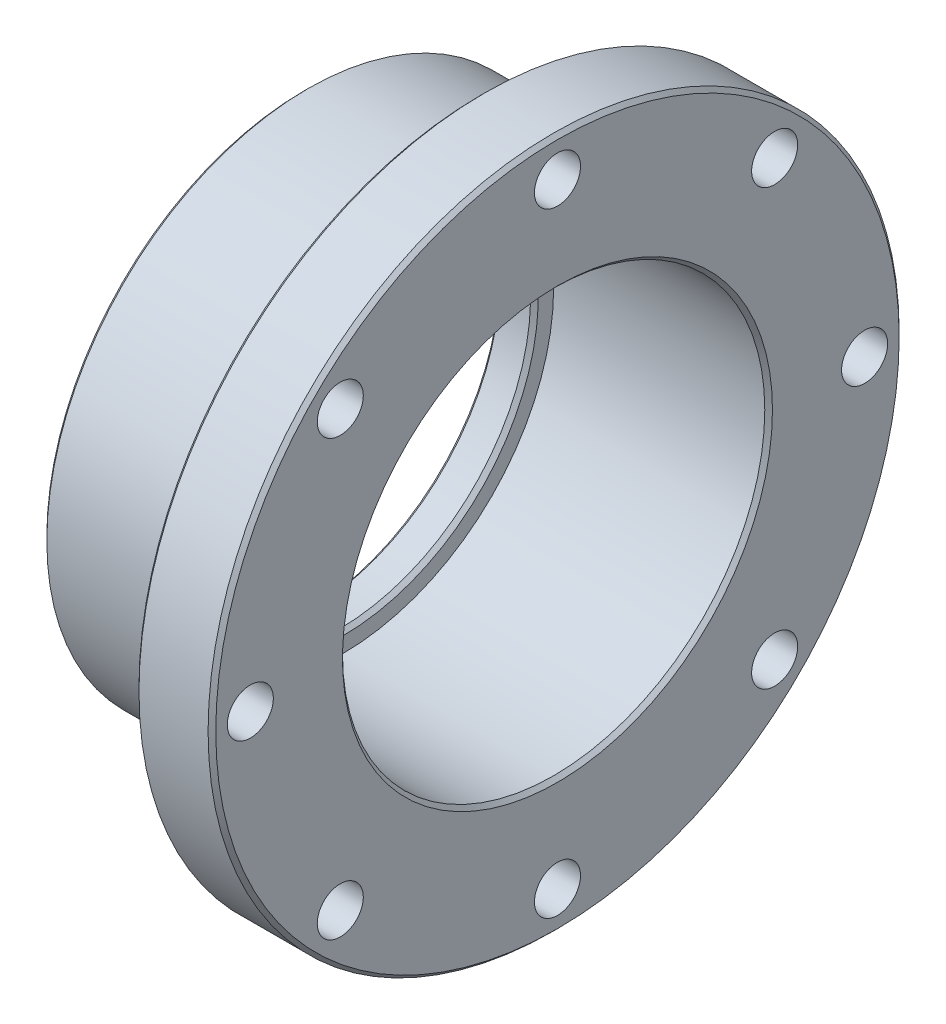
ISO-10303-21;
HEADER;
FILE_DESCRIPTION(('STEP AP214'),'2;1');
FILE_NAME('part.step','',(''),(''),'','','');
FILE_SCHEMA(('AUTOMOTIVE_DESIGN { 1 0 10303 214 1 1 1 1 }'));
ENDSEC;
DATA;
#1=APPLICATION_CONTEXT('core data for automotive mechanical design processes');
#2=APPLICATION_PROTOCOL_DEFINITION('international standard','automotive_design',2000,#1);
#3=PRODUCT_CONTEXT('',#1,'mechanical');
#4=PRODUCT('Part','Part','',(#3));
#5=PRODUCT_RELATED_PRODUCT_CATEGORY('part','',(#4));
#6=PRODUCT_DEFINITION_FORMATION('','',#4);
#7=PRODUCT_DEFINITION_CONTEXT('part definition',#1,'design');
#8=PRODUCT_DEFINITION('design','',#6,#7);
#9=PRODUCT_DEFINITION_SHAPE('','',#8);
#10=(LENGTH_UNIT() NAMED_UNIT(*) SI_UNIT(.MILLI.,.METRE.));
#11=(NAMED_UNIT(*) PLANE_ANGLE_UNIT() SI_UNIT($,.RADIAN.));
#12=(NAMED_UNIT(*) SI_UNIT($,.STERADIAN.) SOLID_ANGLE_UNIT());
#13=UNCERTAINTY_MEASURE_WITH_UNIT(LENGTH_MEASURE(1.E-05),#10,'distance_accuracy_value','');
#14=(GEOMETRIC_REPRESENTATION_CONTEXT(3) GLOBAL_UNCERTAINTY_ASSIGNED_CONTEXT((#13)) GLOBAL_UNIT_ASSIGNED_CONTEXT((#10,
#11,#12)) REPRESENTATION_CONTEXT('',''));
#15=CARTESIAN_POINT('',(0.,0.,0.));
#16=DIRECTION('',(0.,0.,1.));
#17=DIRECTION('',(1.,0.,0.));
#18=AXIS2_PLACEMENT_3D('',#15,#16,#17);
#19=CARTESIAN_POINT('',(0.,0.,0.));
#20=DIRECTION('',(-1.,0.,0.));
#21=DIRECTION('',(0.,0.,1.));
#22=AXIS2_PLACEMENT_3D('',#19,#20,#21);
#23=PLANE('',#22);
#24=CARTESIAN_POINT('',(0.,0.,0.));
#25=DIRECTION('',(-1.,0.,0.));
#26=DIRECTION('',(0.,0.,1.));
#27=AXIS2_PLACEMENT_3D('',#24,#25,#26);
#28=CIRCLE('',#27,33.5);
#29=CARTESIAN_POINT('',(0.,0.,33.5));
#30=VERTEX_POINT('',#29);
#31=EDGE_CURVE('E10',#30,#30,#28,.T.);
#32=ORIENTED_EDGE('',*,*,#31,.T.);
#33=EDGE_LOOP('',(#32));
#34=FACE_BOUND('',#33,.T.);
#35=CARTESIAN_POINT('',(0.,0.,0.));
#36=DIRECTION('',(-1.,0.,0.));
#37=DIRECTION('',(0.,0.,1.));
#38=AXIS2_PLACEMENT_3D('',#35,#36,#37);
#39=CIRCLE('',#38,25.5);
#40=CARTESIAN_POINT('',(0.,0.,25.5));
#41=VERTEX_POINT('',#40);
#42=EDGE_CURVE('E44',#41,#41,#39,.F.);
#43=ORIENTED_EDGE('',*,*,#42,.T.);
#44=EDGE_LOOP('',(#43));
#45=FACE_BOUND('',#44,.T.);
#46=ADVANCED_FACE('F36',(#34,#45),#23,.T.);
#47=CARTESIAN_POINT('',(0.,0.,0.));
#48=DIRECTION('',(1.,0.,0.));
#49=DIRECTION('',(0.,0.,-1.));
#50=AXIS2_PLACEMENT_3D('',#47,#48,#49);
#51=CYLINDRICAL_SURFACE('',#50,34.);
#52=CARTESIAN_POINT('',(0.499999999999994,0.,0.));
#53=DIRECTION('',(-1.,0.,0.));
#54=DIRECTION('',(0.,0.,1.));
#55=AXIS2_PLACEMENT_3D('',#52,#53,#54);
#56=CIRCLE('',#55,34.);
#57=CARTESIAN_POINT('',(0.499999999999994,0.,34.));
#58=VERTEX_POINT('',#57);
#59=EDGE_CURVE('E48',#58,#58,#56,.F.);
#60=ORIENTED_EDGE('',*,*,#59,.T.);
#61=EDGE_LOOP('',(#60));
#62=FACE_BOUND('',#61,.T.);
#63=CARTESIAN_POINT('',(23.,0.,0.));
#64=DIRECTION('',(1.,0.,0.));
#65=DIRECTION('',(0.,0.,-1.));
#66=AXIS2_PLACEMENT_3D('',#63,#64,#65);
#67=CIRCLE('',#66,34.);
#68=CARTESIAN_POINT('',(23.,0.,-34.));
#69=VERTEX_POINT('',#68);
#70=EDGE_CURVE('E81',#69,#69,#67,.T.);
#71=ORIENTED_EDGE('',*,*,#70,.F.);
#72=EDGE_LOOP('',(#71));
#73=FACE_BOUND('',#72,.T.);
#74=ADVANCED_FACE('F142',(#62,#73),#51,.T.);
#75=CARTESIAN_POINT('',(23.,34.,0.));
#76=DIRECTION('',(-1.,0.,0.));
#77=DIRECTION('',(0.,0.,1.));
#78=AXIS2_PLACEMENT_3D('',#75,#76,#77);
#79=PLANE('',#78);
#80=CARTESIAN_POINT('',(23.,0.,0.));
#81=DIRECTION('',(-1.,0.,0.));
#82=DIRECTION('',(0.,0.,1.));
#83=AXIS2_PLACEMENT_3D('',#80,#81,#82);
#84=CIRCLE('',#83,44.5);
#85=CARTESIAN_POINT('',(23.,0.,44.5));
#86=VERTEX_POINT('',#85);
#87=EDGE_CURVE('E52',#86,#86,#84,.T.);
#88=ORIENTED_EDGE('',*,*,#87,.T.);
#89=EDGE_LOOP('',(#88));
#90=FACE_BOUND('',#89,.T.);
#91=CARTESIAN_POINT('',(23.,40.,0.));
#92=DIRECTION('',(-1.,0.,0.));
#93=DIRECTION('',(0.,0.,1.));
#94=AXIS2_PLACEMENT_3D('',#91,#92,#93);
#95=CIRCLE('',#94,3.);
#96=CARTESIAN_POINT('',(23.,40.,3.));
#97=VERTEX_POINT('',#96);
#98=EDGE_CURVE('E87',#97,#97,#95,.T.);
#99=ORIENTED_EDGE('',*,*,#98,.F.);
#100=EDGE_LOOP('',(#99));
#101=FACE_BOUND('',#100,.T.);
#102=CARTESIAN_POINT('',(23.,28.2842712474619,28.2842712474619));
#103=DIRECTION('',(-1.,0.,0.));
#104=DIRECTION('',(0.,0.,1.));
#105=AXIS2_PLACEMENT_3D('',#102,#103,#104);
#106=CIRCLE('',#105,2.99999999999999);
#107=CARTESIAN_POINT('',(23.,28.2842712474619,31.2842712474619));
#108=VERTEX_POINT('',#107);
#109=EDGE_CURVE('E127',#108,#108,#106,.T.);
#110=ORIENTED_EDGE('',*,*,#109,.F.);
#111=EDGE_LOOP('',(#110));
#112=FACE_BOUND('',#111,.T.);
#113=CARTESIAN_POINT('',(23.,0.,40.));
#114=DIRECTION('',(-1.,0.,0.));
#115=DIRECTION('',(0.,0.,1.));
#116=AXIS2_PLACEMENT_3D('',#113,#114,#115);
#117=CIRCLE('',#116,3.);
#118=CARTESIAN_POINT('',(23.,0.,43.));
#119=VERTEX_POINT('',#118);
#120=EDGE_CURVE('E121',#119,#119,#117,.T.);
#121=ORIENTED_EDGE('',*,*,#120,.F.);
#122=EDGE_LOOP('',(#121));
#123=FACE_BOUND('',#122,.T.);
#124=CARTESIAN_POINT('',(23.,-28.2842712474619,28.2842712474619));
#125=DIRECTION('',(-1.,0.,0.));
#126=DIRECTION('',(0.,0.,1.));
#127=AXIS2_PLACEMENT_3D('',#124,#125,#126);
#128=CIRCLE('',#127,2.99999999999999);
#129=CARTESIAN_POINT('',(23.,-28.2842712474619,31.2842712474619));
#130=VERTEX_POINT('',#129);
#131=EDGE_CURVE('E115',#130,#130,#128,.T.);
#132=ORIENTED_EDGE('',*,*,#131,.F.);
#133=EDGE_LOOP('',(#132));
#134=FACE_BOUND('',#133,.T.);
#135=CARTESIAN_POINT('',(23.,-40.,0.));
#136=DIRECTION('',(-1.,0.,0.));
#137=DIRECTION('',(0.,0.,1.));
#138=AXIS2_PLACEMENT_3D('',#135,#136,#137);
#139=CIRCLE('',#138,3.);
#140=CARTESIAN_POINT('',(23.,-40.,3.00000000000001));
#141=VERTEX_POINT('',#140);
#142=EDGE_CURVE('E109',#141,#141,#139,.T.);
#143=ORIENTED_EDGE('',*,*,#142,.F.);
#144=EDGE_LOOP('',(#143));
#145=FACE_BOUND('',#144,.T.);
#146=CARTESIAN_POINT('',(23.,-28.2842712474619,-28.2842712474619));
#147=DIRECTION('',(-1.,0.,0.));
#148=DIRECTION('',(0.,0.,1.));
#149=AXIS2_PLACEMENT_3D('',#146,#147,#148);
#150=CIRCLE('',#149,2.99999999999999);
#151=CARTESIAN_POINT('',(23.,-28.2842712474619,-25.2842712474619));
#152=VERTEX_POINT('',#151);
#153=EDGE_CURVE('E103',#152,#152,#150,.T.);
#154=ORIENTED_EDGE('',*,*,#153,.F.);
#155=EDGE_LOOP('',(#154));
#156=FACE_BOUND('',#155,.T.);
#157=CARTESIAN_POINT('',(23.,0.,-40.));
#158=DIRECTION('',(-1.,0.,0.));
#159=DIRECTION('',(0.,0.,1.));
#160=AXIS2_PLACEMENT_3D('',#157,#158,#159);
#161=CIRCLE('',#160,3.);
#162=CARTESIAN_POINT('',(23.,0.,-37.));
#163=VERTEX_POINT('',#162);
#164=EDGE_CURVE('E97',#163,#163,#161,.T.);
#165=ORIENTED_EDGE('',*,*,#164,.F.);
#166=EDGE_LOOP('',(#165));
#167=FACE_BOUND('',#166,.T.);
#168=CARTESIAN_POINT('',(23.,28.2842712474619,-28.2842712474619));
#169=DIRECTION('',(-1.,0.,0.));
#170=DIRECTION('',(0.,0.,1.));
#171=AXIS2_PLACEMENT_3D('',#168,#169,#170);
#172=CIRCLE('',#171,3.);
#173=CARTESIAN_POINT('',(23.,28.2842712474619,-25.2842712474619));
#174=VERTEX_POINT('',#173);
#175=EDGE_CURVE('E91',#174,#174,#172,.T.);
#176=ORIENTED_EDGE('',*,*,#175,.F.);
#177=EDGE_LOOP('',(#176));
#178=FACE_BOUND('',#177,.T.);
#179=ORIENTED_EDGE('',*,*,#70,.T.);
#180=EDGE_LOOP('',(#179));
#181=FACE_BOUND('',#180,.T.);
#182=ADVANCED_FACE('F138',(#90,#101,#112,#123,#134,#145,#156,#167,#178,#181),#79,.T.);
#183=CARTESIAN_POINT('',(0.,0.,0.));
#184=DIRECTION('',(1.,0.,0.));
#185=DIRECTION('',(0.,0.,-1.));
#186=AXIS2_PLACEMENT_3D('',#183,#184,#185);
#187=CYLINDRICAL_SURFACE('',#186,45.);
#188=CARTESIAN_POINT('',(32.5,0.,0.));
#189=DIRECTION('',(1.,0.,0.));
#190=DIRECTION('',(0.,0.,-1.));
#191=AXIS2_PLACEMENT_3D('',#188,#189,#190);
#192=CIRCLE('',#191,45.);
#193=CARTESIAN_POINT('',(32.5,0.,-45.));
#194=VERTEX_POINT('',#193);
#195=EDGE_CURVE('E57',#194,#194,#192,.F.);
#196=ORIENTED_EDGE('',*,*,#195,.T.);
#197=EDGE_LOOP('',(#196));
#198=FACE_BOUND('',#197,.T.);
#199=CARTESIAN_POINT('',(23.5,0.,0.));
#200=DIRECTION('',(-1.,0.,0.));
#201=DIRECTION('',(0.,0.,1.));
#202=AXIS2_PLACEMENT_3D('',#199,#200,#201);
#203=CIRCLE('',#202,45.);
#204=CARTESIAN_POINT('',(23.5,0.,45.));
#205=VERTEX_POINT('',#204);
#206=EDGE_CURVE('E60',#205,#205,#203,.F.);
#207=ORIENTED_EDGE('',*,*,#206,.T.);
#208=EDGE_LOOP('',(#207));
#209=FACE_BOUND('',#208,.T.);
#210=ADVANCED_FACE('F141',(#198,#209),#187,.T.);
#211=CARTESIAN_POINT('',(33.,45.,0.));
#212=DIRECTION('',(1.,0.,0.));
#213=DIRECTION('',(0.,0.,-1.));
#214=AXIS2_PLACEMENT_3D('',#211,#212,#213);
#215=PLANE('',#214);
#216=CARTESIAN_POINT('',(33.,0.,0.));
#217=DIRECTION('',(1.,0.,0.));
#218=DIRECTION('',(0.,0.,-1.));
#219=AXIS2_PLACEMENT_3D('',#216,#217,#218);
#220=CIRCLE('',#219,28.);
#221=CARTESIAN_POINT('',(33.,0.,-28.));
#222=VERTEX_POINT('',#221);
#223=EDGE_CURVE('E63',#222,#222,#220,.F.);
#224=ORIENTED_EDGE('',*,*,#223,.T.);
#225=EDGE_LOOP('',(#224));
#226=FACE_BOUND('',#225,.T.);
#227=CARTESIAN_POINT('',(33.,0.,0.));
#228=DIRECTION('',(1.,0.,0.));
#229=DIRECTION('',(0.,0.,-1.));
#230=AXIS2_PLACEMENT_3D('',#227,#228,#229);
#231=CIRCLE('',#230,44.5);
#232=CARTESIAN_POINT('',(33.,0.,-44.5));
#233=VERTEX_POINT('',#232);
#234=EDGE_CURVE('E66',#233,#233,#231,.T.);
#235=ORIENTED_EDGE('',*,*,#234,.T.);
#236=EDGE_LOOP('',(#235));
#237=FACE_BOUND('',#236,.T.);
#238=CARTESIAN_POINT('',(33.,40.,0.));
#239=DIRECTION('',(1.,0.,0.));
#240=DIRECTION('',(0.,0.,-1.));
#241=AXIS2_PLACEMENT_3D('',#238,#239,#240);
#242=CIRCLE('',#241,3.);
#243=CARTESIAN_POINT('',(33.,40.,-3.));
#244=VERTEX_POINT('',#243);
#245=EDGE_CURVE('E130',#244,#244,#242,.F.);
#246=ORIENTED_EDGE('',*,*,#245,.T.);
#247=EDGE_LOOP('',(#246));
#248=FACE_BOUND('',#247,.T.);
#249=CARTESIAN_POINT('',(33.,28.2842712474619,28.2842712474619));
#250=DIRECTION('',(1.,0.,0.));
#251=DIRECTION('',(0.,0.,-1.));
#252=AXIS2_PLACEMENT_3D('',#249,#250,#251);
#253=CIRCLE('',#252,2.99999999999999);
#254=CARTESIAN_POINT('',(33.,28.2842712474619,25.2842712474619));
#255=VERTEX_POINT('',#254);
#256=EDGE_CURVE('E124',#255,#255,#253,.F.);
#257=ORIENTED_EDGE('',*,*,#256,.T.);
#258=EDGE_LOOP('',(#257));
#259=FACE_BOUND('',#258,.T.);
#260=CARTESIAN_POINT('',(33.,0.,40.));
#261=DIRECTION('',(1.,0.,0.));
#262=DIRECTION('',(0.,0.,-1.));
#263=AXIS2_PLACEMENT_3D('',#260,#261,#262);
#264=CIRCLE('',#263,3.);
#265=CARTESIAN_POINT('',(33.,0.,37.));
#266=VERTEX_POINT('',#265);
#267=EDGE_CURVE('E118',#266,#266,#264,.F.);
#268=ORIENTED_EDGE('',*,*,#267,.T.);
#269=EDGE_LOOP('',(#268));
#270=FACE_BOUND('',#269,.T.);
#271=CARTESIAN_POINT('',(33.,-28.2842712474619,28.2842712474619));
#272=DIRECTION('',(1.,0.,0.));
#273=DIRECTION('',(0.,0.,-1.));
#274=AXIS2_PLACEMENT_3D('',#271,#272,#273);
#275=CIRCLE('',#274,2.99999999999999);
#276=CARTESIAN_POINT('',(33.,-28.2842712474619,25.2842712474619));
#277=VERTEX_POINT('',#276);
#278=EDGE_CURVE('E112',#277,#277,#275,.F.);
#279=ORIENTED_EDGE('',*,*,#278,.T.);
#280=EDGE_LOOP('',(#279));
#281=FACE_BOUND('',#280,.T.);
#282=CARTESIAN_POINT('',(33.,-40.,0.));
#283=DIRECTION('',(1.,0.,0.));
#284=DIRECTION('',(0.,0.,-1.));
#285=AXIS2_PLACEMENT_3D('',#282,#283,#284);
#286=CIRCLE('',#285,3.);
#287=CARTESIAN_POINT('',(33.,-40.,-3.));
#288=VERTEX_POINT('',#287);
#289=EDGE_CURVE('E106',#288,#288,#286,.F.);
#290=ORIENTED_EDGE('',*,*,#289,.T.);
#291=EDGE_LOOP('',(#290));
#292=FACE_BOUND('',#291,.T.);
#293=CARTESIAN_POINT('',(33.,-28.2842712474619,-28.2842712474619));
#294=DIRECTION('',(1.,0.,0.));
#295=DIRECTION('',(0.,0.,-1.));
#296=AXIS2_PLACEMENT_3D('',#293,#294,#295);
#297=CIRCLE('',#296,2.99999999999999);
#298=CARTESIAN_POINT('',(33.,-28.2842712474619,-31.2842712474619));
#299=VERTEX_POINT('',#298);
#300=EDGE_CURVE('E100',#299,#299,#297,.F.);
#301=ORIENTED_EDGE('',*,*,#300,.T.);
#302=EDGE_LOOP('',(#301));
#303=FACE_BOUND('',#302,.T.);
#304=CARTESIAN_POINT('',(33.,0.,-40.));
#305=DIRECTION('',(1.,0.,0.));
#306=DIRECTION('',(0.,0.,-1.));
#307=AXIS2_PLACEMENT_3D('',#304,#305,#306);
#308=CIRCLE('',#307,3.);
#309=CARTESIAN_POINT('',(33.,0.,-43.));
#310=VERTEX_POINT('',#309);
#311=EDGE_CURVE('E94',#310,#310,#308,.F.);
#312=ORIENTED_EDGE('',*,*,#311,.T.);
#313=EDGE_LOOP('',(#312));
#314=FACE_BOUND('',#313,.T.);
#315=CARTESIAN_POINT('',(33.,28.2842712474619,-28.2842712474619));
#316=DIRECTION('',(1.,0.,0.));
#317=DIRECTION('',(0.,0.,-1.));
#318=AXIS2_PLACEMENT_3D('',#315,#316,#317);
#319=CIRCLE('',#318,3.);
#320=CARTESIAN_POINT('',(33.,28.2842712474619,-31.2842712474619));
#321=VERTEX_POINT('',#320);
#322=EDGE_CURVE('E88',#321,#321,#319,.F.);
#323=ORIENTED_EDGE('',*,*,#322,.T.);
#324=EDGE_LOOP('',(#323));
#325=FACE_BOUND('',#324,.T.);
#326=ADVANCED_FACE('F217',(#226,#237,#248,#259,#270,#281,#292,#303,#314,#325),#215,.T.);
#327=CARTESIAN_POINT('',(0.,0.,0.));
#328=DIRECTION('',(1.,0.,0.));
#329=DIRECTION('',(0.,1.,0.));
#330=AXIS2_PLACEMENT_3D('',#327,#328,#329);
#331=CYLINDRICAL_SURFACE('',#330,25.);
#332=CARTESIAN_POINT('',(4.50000000000002,0.,0.));
#333=DIRECTION('',(-1.,0.,0.));
#334=DIRECTION('',(0.,-1.,0.));
#335=AXIS2_PLACEMENT_3D('',#332,#333,#334);
#336=CIRCLE('',#335,25.);
#337=CARTESIAN_POINT('',(4.50000000000002,-25.,0.));
#338=VERTEX_POINT('',#337);
#339=EDGE_CURVE('E75',#338,#338,#336,.F.);
#340=ORIENTED_EDGE('',*,*,#339,.T.);
#341=EDGE_LOOP('',(#340));
#342=FACE_BOUND('',#341,.T.);
#343=CARTESIAN_POINT('',(0.500000000000028,0.,0.));
#344=DIRECTION('',(-1.,0.,0.));
#345=DIRECTION('',(0.,-1.,0.));
#346=AXIS2_PLACEMENT_3D('',#343,#344,#345);
#347=CIRCLE('',#346,25.);
#348=CARTESIAN_POINT('',(0.500000000000031,-25.,0.));
#349=VERTEX_POINT('',#348);
#350=EDGE_CURVE('E78',#349,#349,#347,.T.);
#351=ORIENTED_EDGE('',*,*,#350,.T.);
#352=EDGE_LOOP('',(#351));
#353=FACE_BOUND('',#352,.T.);
#354=ADVANCED_FACE('F214',(#342,#353),#331,.F.);
#355=CARTESIAN_POINT('',(4.99999999999999,25.,0.));
#356=DIRECTION('',(-1.,0.,0.));
#357=DIRECTION('',(0.,-1.,0.));
#358=AXIS2_PLACEMENT_3D('',#355,#356,#357);
#359=PLANE('',#358);
#360=CARTESIAN_POINT('',(5.,0.,0.));
#361=DIRECTION('',(-1.,0.,0.));
#362=DIRECTION('',(0.,-1.,0.));
#363=AXIS2_PLACEMENT_3D('',#360,#361,#362);
#364=CIRCLE('',#363,25.5);
#365=CARTESIAN_POINT('',(5.,-25.5,0.));
#366=VERTEX_POINT('',#365);
#367=EDGE_CURVE('E72',#366,#366,#364,.T.);
#368=ORIENTED_EDGE('',*,*,#367,.T.);
#369=EDGE_LOOP('',(#368));
#370=FACE_BOUND('',#369,.T.);
#371=CARTESIAN_POINT('',(5.,0.,0.));
#372=DIRECTION('',(1.,0.,0.));
#373=DIRECTION('',(0.,1.,0.));
#374=AXIS2_PLACEMENT_3D('',#371,#372,#373);
#375=CIRCLE('',#374,27.5);
#376=CARTESIAN_POINT('',(4.99999999999999,27.5,0.));
#377=VERTEX_POINT('',#376);
#378=EDGE_CURVE('E84',#377,#377,#375,.T.);
#379=ORIENTED_EDGE('',*,*,#378,.T.);
#380=EDGE_LOOP('',(#379));
#381=FACE_BOUND('',#380,.T.);
#382=ADVANCED_FACE('F216',(#370,#381),#359,.F.);
#383=CARTESIAN_POINT('',(0.,0.,0.));
#384=DIRECTION('',(1.,0.,0.));
#385=DIRECTION('',(0.,1.,0.));
#386=AXIS2_PLACEMENT_3D('',#383,#384,#385);
#387=CYLINDRICAL_SURFACE('',#386,27.5);
#388=CARTESIAN_POINT('',(32.5,0.,0.));
#389=DIRECTION('',(1.,0.,0.));
#390=DIRECTION('',(0.,1.,0.));
#391=AXIS2_PLACEMENT_3D('',#388,#389,#390);
#392=CIRCLE('',#391,27.5);
#393=CARTESIAN_POINT('',(32.5,27.5,0.));
#394=VERTEX_POINT('',#393);
#395=EDGE_CURVE('E69',#394,#394,#392,.T.);
#396=ORIENTED_EDGE('',*,*,#395,.T.);
#397=EDGE_LOOP('',(#396));
#398=FACE_BOUND('',#397,.T.);
#399=ORIENTED_EDGE('',*,*,#378,.F.);
#400=EDGE_LOOP('',(#399));
#401=FACE_BOUND('',#400,.T.);
#402=ADVANCED_FACE('F224',(#398,#401),#387,.F.);
#403=CARTESIAN_POINT('',(33.001,28.2842712474619,-28.2842712474619));
#404=DIRECTION('',(-1.,0.,0.));
#405=DIRECTION('',(0.,0.,1.));
#406=AXIS2_PLACEMENT_3D('',#403,#404,#405);
#407=CYLINDRICAL_SURFACE('',#406,3.);
#408=ORIENTED_EDGE('',*,*,#322,.F.);
#409=EDGE_LOOP('',(#408));
#410=FACE_BOUND('',#409,.T.);
#411=ORIENTED_EDGE('',*,*,#175,.T.);
#412=EDGE_LOOP('',(#411));
#413=FACE_BOUND('',#412,.T.);
#414=ADVANCED_FACE('F258',(#410,#413),#407,.F.);
#415=CARTESIAN_POINT('',(33.001,0.,-40.));
#416=DIRECTION('',(-1.,0.,0.));
#417=DIRECTION('',(0.,0.,1.));
#418=AXIS2_PLACEMENT_3D('',#415,#416,#417);
#419=CYLINDRICAL_SURFACE('',#418,3.);
#420=ORIENTED_EDGE('',*,*,#311,.F.);
#421=EDGE_LOOP('',(#420));
#422=FACE_BOUND('',#421,.T.);
#423=ORIENTED_EDGE('',*,*,#164,.T.);
#424=EDGE_LOOP('',(#423));
#425=FACE_BOUND('',#424,.T.);
#426=ADVANCED_FACE('F261',(#422,#425),#419,.F.);
#427=CARTESIAN_POINT('',(33.001,-28.2842712474619,-28.2842712474619));
#428=DIRECTION('',(-1.,0.,0.));
#429=DIRECTION('',(0.,0.,1.));
#430=AXIS2_PLACEMENT_3D('',#427,#428,#429);
#431=CYLINDRICAL_SURFACE('',#430,2.99999999999999);
#432=ORIENTED_EDGE('',*,*,#300,.F.);
#433=EDGE_LOOP('',(#432));
#434=FACE_BOUND('',#433,.T.);
#435=ORIENTED_EDGE('',*,*,#153,.T.);
#436=EDGE_LOOP('',(#435));
#437=FACE_BOUND('',#436,.T.);
#438=ADVANCED_FACE('F267',(#434,#437),#431,.F.);
#439=CARTESIAN_POINT('',(33.001,-40.,0.));
#440=DIRECTION('',(-1.,0.,0.));
#441=DIRECTION('',(0.,0.,1.));
#442=AXIS2_PLACEMENT_3D('',#439,#440,#441);
#443=CYLINDRICAL_SURFACE('',#442,3.);
#444=ORIENTED_EDGE('',*,*,#289,.F.);
#445=EDGE_LOOP('',(#444));
#446=FACE_BOUND('',#445,.T.);
#447=ORIENTED_EDGE('',*,*,#142,.T.);
#448=EDGE_LOOP('',(#447));
#449=FACE_BOUND('',#448,.T.);
#450=ADVANCED_FACE('F274',(#446,#449),#443,.F.);
#451=CARTESIAN_POINT('',(33.001,-28.2842712474619,28.2842712474619));
#452=DIRECTION('',(-1.,0.,0.));
#453=DIRECTION('',(0.,0.,1.));
#454=AXIS2_PLACEMENT_3D('',#451,#452,#453);
#455=CYLINDRICAL_SURFACE('',#454,2.99999999999999);
#456=ORIENTED_EDGE('',*,*,#278,.F.);
#457=EDGE_LOOP('',(#456));
#458=FACE_BOUND('',#457,.T.);
#459=ORIENTED_EDGE('',*,*,#131,.T.);
#460=EDGE_LOOP('',(#459));
#461=FACE_BOUND('',#460,.T.);
#462=ADVANCED_FACE('F278',(#458,#461),#455,.F.);
#463=CARTESIAN_POINT('',(33.001,0.,40.));
#464=DIRECTION('',(-1.,0.,0.));
#465=DIRECTION('',(0.,0.,1.));
#466=AXIS2_PLACEMENT_3D('',#463,#464,#465);
#467=CYLINDRICAL_SURFACE('',#466,3.);
#468=ORIENTED_EDGE('',*,*,#267,.F.);
#469=EDGE_LOOP('',(#468));
#470=FACE_BOUND('',#469,.T.);
#471=ORIENTED_EDGE('',*,*,#120,.T.);
#472=EDGE_LOOP('',(#471));
#473=FACE_BOUND('',#472,.T.);
#474=ADVANCED_FACE('F282',(#470,#473),#467,.F.);
#475=CARTESIAN_POINT('',(33.001,28.2842712474619,28.2842712474619));
#476=DIRECTION('',(-1.,0.,0.));
#477=DIRECTION('',(0.,0.,1.));
#478=AXIS2_PLACEMENT_3D('',#475,#476,#477);
#479=CYLINDRICAL_SURFACE('',#478,2.99999999999999);
#480=ORIENTED_EDGE('',*,*,#256,.F.);
#481=EDGE_LOOP('',(#480));
#482=FACE_BOUND('',#481,.T.);
#483=ORIENTED_EDGE('',*,*,#109,.T.);
#484=EDGE_LOOP('',(#483));
#485=FACE_BOUND('',#484,.T.);
#486=ADVANCED_FACE('F286',(#482,#485),#479,.F.);
#487=CARTESIAN_POINT('',(33.001,40.,0.));
#488=DIRECTION('',(-1.,0.,0.));
#489=DIRECTION('',(0.,0.,1.));
#490=AXIS2_PLACEMENT_3D('',#487,#488,#489);
#491=CYLINDRICAL_SURFACE('',#490,3.);
#492=ORIENTED_EDGE('',*,*,#245,.F.);
#493=EDGE_LOOP('',(#492));
#494=FACE_BOUND('',#493,.T.);
#495=ORIENTED_EDGE('',*,*,#98,.T.);
#496=EDGE_LOOP('',(#495));
#497=FACE_BOUND('',#496,.T.);
#498=ADVANCED_FACE('F136',(#494,#497),#491,.F.);
#499=CARTESIAN_POINT('',(4.50000000000002,0.,0.));
#500=DIRECTION('',(1.,0.,0.));
#501=DIRECTION('',(0.,1.,0.));
#502=AXIS2_PLACEMENT_3D('',#499,#500,#501);
#503=CONICAL_SURFACE('',#502,25.,0.785398163397445);
#504=ORIENTED_EDGE('',*,*,#367,.F.);
#505=EDGE_LOOP('',(#504));
#506=FACE_BOUND('',#505,.T.);
#507=ORIENTED_EDGE('',*,*,#339,.F.);
#508=EDGE_LOOP('',(#507));
#509=FACE_BOUND('',#508,.T.);
#510=ADVANCED_FACE('F171',(#506,#509),#503,.F.);
#511=CARTESIAN_POINT('',(32.5,0.,0.));
#512=DIRECTION('',(1.,0.,0.));
#513=DIRECTION('',(0.,1.,0.));
#514=AXIS2_PLACEMENT_3D('',#511,#512,#513);
#515=CONICAL_SURFACE('',#514,27.5,0.785398163397452);
#516=ORIENTED_EDGE('',*,*,#223,.F.);
#517=EDGE_LOOP('',(#516));
#518=FACE_BOUND('',#517,.T.);
#519=ORIENTED_EDGE('',*,*,#395,.F.);
#520=EDGE_LOOP('',(#519));
#521=FACE_BOUND('',#520,.T.);
#522=ADVANCED_FACE('F177',(#518,#521),#515,.F.);
#523=CARTESIAN_POINT('',(33.,0.,0.));
#524=DIRECTION('',(-1.,0.,0.));
#525=DIRECTION('',(0.,0.,1.));
#526=AXIS2_PLACEMENT_3D('',#523,#524,#525);
#527=CONICAL_SURFACE('',#526,44.5,0.785398163397469);
#528=ORIENTED_EDGE('',*,*,#195,.F.);
#529=EDGE_LOOP('',(#528));
#530=FACE_BOUND('',#529,.T.);
#531=ORIENTED_EDGE('',*,*,#234,.F.);
#532=EDGE_LOOP('',(#531));
#533=FACE_BOUND('',#532,.T.);
#534=ADVANCED_FACE('F184',(#530,#533),#527,.T.);
#535=CARTESIAN_POINT('',(23.5,0.,0.));
#536=DIRECTION('',(1.,0.,0.));
#537=DIRECTION('',(0.,0.,-1.));
#538=AXIS2_PLACEMENT_3D('',#535,#536,#537);
#539=CONICAL_SURFACE('',#538,45.,0.785398163397448);
#540=ORIENTED_EDGE('',*,*,#87,.F.);
#541=EDGE_LOOP('',(#540));
#542=FACE_BOUND('',#541,.T.);
#543=ORIENTED_EDGE('',*,*,#206,.F.);
#544=EDGE_LOOP('',(#543));
#545=FACE_BOUND('',#544,.T.);
#546=ADVANCED_FACE('F191',(#542,#545),#539,.T.);
#547=CARTESIAN_POINT('',(0.499999999999994,0.,0.));
#548=DIRECTION('',(1.,0.,0.));
#549=DIRECTION('',(0.,0.,-1.));
#550=AXIS2_PLACEMENT_3D('',#547,#548,#549);
#551=CONICAL_SURFACE('',#550,34.,0.785398163397448);
#552=ORIENTED_EDGE('',*,*,#31,.F.);
#553=EDGE_LOOP('',(#552));
#554=FACE_BOUND('',#553,.T.);
#555=ORIENTED_EDGE('',*,*,#59,.F.);
#556=EDGE_LOOP('',(#555));
#557=FACE_BOUND('',#556,.T.);
#558=ADVANCED_FACE('F197',(#554,#557),#551,.T.);
#559=CARTESIAN_POINT('',(0.,0.,0.));
#560=DIRECTION('',(-1.,0.,0.));
#561=DIRECTION('',(0.,-1.,0.));
#562=AXIS2_PLACEMENT_3D('',#559,#560,#561);
#563=CONICAL_SURFACE('',#562,25.5,0.785398163397445);
#564=ORIENTED_EDGE('',*,*,#350,.F.);
#565=EDGE_LOOP('',(#564));
#566=FACE_BOUND('',#565,.T.);
#567=ORIENTED_EDGE('',*,*,#42,.F.);
#568=EDGE_LOOP('',(#567));
#569=FACE_BOUND('',#568,.T.);
#570=ADVANCED_FACE('F39',(#566,#569),#563,.F.);
#571=CLOSED_SHELL('',(#46,#74,#182,#210,#326,#354,#382,#402,#414,#426,#438,#450,#462,#474,#486,
#498,#510,#522,#534,#546,#558,#570));
#572=MANIFOLD_SOLID_BREP('B2',#571);
#573=ADVANCED_BREP_SHAPE_REPRESENTATION('',(#18,#572),#14);
#574=SHAPE_DEFINITION_REPRESENTATION(#9,#573);
ENDSEC;
END-ISO-10303-21;
